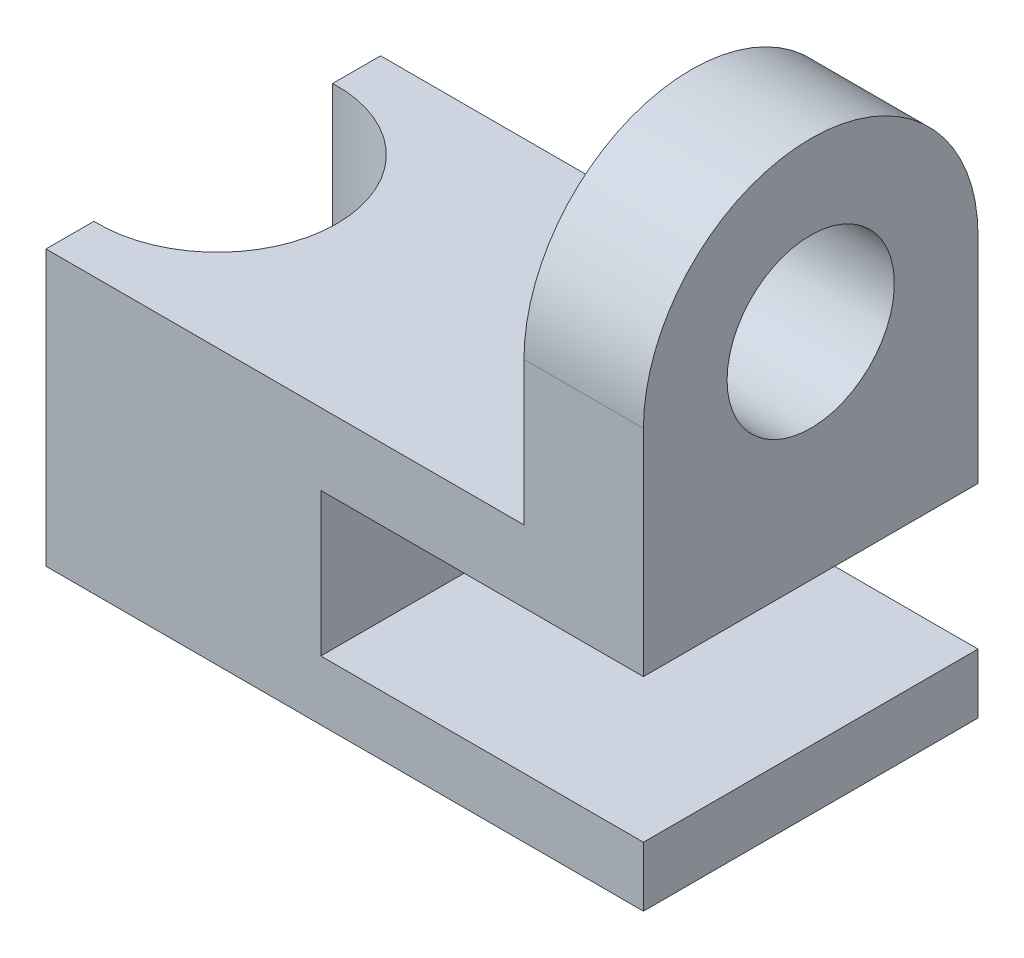
ISO-10303-21;
HEADER;
FILE_DESCRIPTION(('STEP AP214'),'2;1');
FILE_NAME('part.step','',(''),(''),'','','');
FILE_SCHEMA(('AUTOMOTIVE_DESIGN { 1 0 10303 214 1 1 1 1 }'));
ENDSEC;
DATA;
#1=APPLICATION_CONTEXT('core data for automotive mechanical design processes');
#2=APPLICATION_PROTOCOL_DEFINITION('international standard','automotive_design',2000,#1);
#3=PRODUCT_CONTEXT('',#1,'mechanical');
#4=PRODUCT('Part','Part','',(#3));
#5=PRODUCT_RELATED_PRODUCT_CATEGORY('part','',(#4));
#6=PRODUCT_DEFINITION_FORMATION('','',#4);
#7=PRODUCT_DEFINITION_CONTEXT('part definition',#1,'design');
#8=PRODUCT_DEFINITION('design','',#6,#7);
#9=PRODUCT_DEFINITION_SHAPE('','',#8);
#10=(LENGTH_UNIT() NAMED_UNIT(*) SI_UNIT(.MILLI.,.METRE.));
#11=(NAMED_UNIT(*) PLANE_ANGLE_UNIT() SI_UNIT($,.RADIAN.));
#12=(NAMED_UNIT(*) SI_UNIT($,.STERADIAN.) SOLID_ANGLE_UNIT());
#13=UNCERTAINTY_MEASURE_WITH_UNIT(LENGTH_MEASURE(1.E-05),#10,'distance_accuracy_value','');
#14=(GEOMETRIC_REPRESENTATION_CONTEXT(3) GLOBAL_UNCERTAINTY_ASSIGNED_CONTEXT((#13)) GLOBAL_UNIT_ASSIGNED_CONTEXT((#10,
#11,#12)) REPRESENTATION_CONTEXT('',''));
#15=CARTESIAN_POINT('',(0.,0.,0.));
#16=DIRECTION('',(0.,0.,1.));
#17=DIRECTION('',(1.,0.,0.));
#18=AXIS2_PLACEMENT_3D('',#15,#16,#17);
#19=CARTESIAN_POINT('',(-50000.,-5000.00000000001,28000.));
#20=DIRECTION('',(1.,0.,0.));
#21=DIRECTION('',(0.,0.,-1.));
#22=AXIS2_PLACEMENT_3D('',#19,#20,#21);
#23=PLANE('',#22);
#24=DIRECTION('',(0.,0.,-1.));
#25=VECTOR('',#24,1.);
#26=CARTESIAN_POINT('',(-50000.,-5000.00000000001,28000.));
#27=LINE('',#26,#25);
#28=CARTESIAN_POINT('',(-50000.,-5000.00000000001,4005.79463013171));
#29=VERTEX_POINT('',#28);
#30=CARTESIAN_POINT('',(-50000.,-5000.00000000001,0.));
#31=VERTEX_POINT('',#30);
#32=EDGE_CURVE('E142',#29,#31,#27,.T.);
#33=ORIENTED_EDGE('',*,*,#32,.F.);
#34=DIRECTION('',(0.,1.,0.));
#35=VECTOR('',#34,1.);
#36=CARTESIAN_POINT('',(-50000.,-5000.00000000001,4005.79463013171));
#37=LINE('',#36,#35);
#38=CARTESIAN_POINT('',(-50000.,18000.,4005.79463013171));
#39=VERTEX_POINT('',#38);
#40=EDGE_CURVE('E50',#29,#39,#37,.T.);
#41=ORIENTED_EDGE('',*,*,#40,.T.);
#42=DIRECTION('',(0.,0.,-1.));
#43=VECTOR('',#42,1.);
#44=CARTESIAN_POINT('',(-50000.,18000.,28000.));
#45=LINE('',#44,#43);
#46=CARTESIAN_POINT('',(-50000.,18000.,0.));
#47=VERTEX_POINT('',#46);
#48=EDGE_CURVE('E141',#39,#47,#45,.T.);
#49=ORIENTED_EDGE('',*,*,#48,.T.);
#50=DIRECTION('',(0.,-1.,0.));
#51=VECTOR('',#50,1.);
#52=CARTESIAN_POINT('',(-50000.,-5000.00000000001,0.));
#53=LINE('',#52,#51);
#54=EDGE_CURVE('E168',#47,#31,#53,.T.);
#55=ORIENTED_EDGE('',*,*,#54,.T.);
#56=EDGE_LOOP('',(#33,#41,#49,#55));
#57=FACE_BOUND('',#56,.T.);
#58=ADVANCED_FACE('F35',(#57),#23,.F.);
#59=CARTESIAN_POINT('',(-27000.,0.,28000.));
#60=DIRECTION('',(0.,-1.,0.));
#61=DIRECTION('',(0.,0.,-1.));
#62=AXIS2_PLACEMENT_3D('',#59,#60,#61);
#63=PLANE('',#62);
#64=DIRECTION('',(-1.,0.,0.));
#65=VECTOR('',#64,1.);
#66=CARTESIAN_POINT('',(-27000.,0.,0.));
#67=LINE('',#66,#65);
#68=CARTESIAN_POINT('',(0.,0.,0.));
#69=VERTEX_POINT('',#68);
#70=CARTESIAN_POINT('',(-27000.,0.,0.));
#71=VERTEX_POINT('',#70);
#72=EDGE_CURVE('E151',#69,#71,#67,.T.);
#73=ORIENTED_EDGE('',*,*,#72,.T.);
#74=DIRECTION('',(0.,0.,-1.));
#75=VECTOR('',#74,1.);
#76=CARTESIAN_POINT('',(-27000.,0.,28000.));
#77=LINE('',#76,#75);
#78=CARTESIAN_POINT('',(-27000.,0.,28000.));
#79=VERTEX_POINT('',#78);
#80=EDGE_CURVE('E11',#79,#71,#77,.T.);
#81=ORIENTED_EDGE('',*,*,#80,.F.);
#82=DIRECTION('',(-1.,0.,0.));
#83=VECTOR('',#82,1.);
#84=CARTESIAN_POINT('',(-27000.,0.,28000.));
#85=LINE('',#84,#83);
#86=CARTESIAN_POINT('',(0.,0.,28000.));
#87=VERTEX_POINT('',#86);
#88=EDGE_CURVE('E174',#87,#79,#85,.T.);
#89=ORIENTED_EDGE('',*,*,#88,.F.);
#90=DIRECTION('',(0.,0.,-1.));
#91=VECTOR('',#90,1.);
#92=CARTESIAN_POINT('',(0.,0.,28000.));
#93=LINE('',#92,#91);
#94=EDGE_CURVE('E147',#87,#69,#93,.T.);
#95=ORIENTED_EDGE('',*,*,#94,.T.);
#96=EDGE_LOOP('',(#73,#81,#89,#95));
#97=FACE_BOUND('',#96,.T.);
#98=ADVANCED_FACE('F37',(#97),#63,.F.);
#99=CARTESIAN_POINT('',(-27000.,12000.,28000.));
#100=DIRECTION('',(-1.,0.,0.));
#101=DIRECTION('',(0.,0.,1.));
#102=AXIS2_PLACEMENT_3D('',#99,#100,#101);
#103=PLANE('',#102);
#104=DIRECTION('',(0.,1.,0.));
#105=VECTOR('',#104,1.);
#106=CARTESIAN_POINT('',(-27000.,12000.,0.));
#107=LINE('',#106,#105);
#108=CARTESIAN_POINT('',(-27000.,12000.,0.));
#109=VERTEX_POINT('',#108);
#110=EDGE_CURVE('E154',#71,#109,#107,.T.);
#111=ORIENTED_EDGE('',*,*,#110,.T.);
#112=DIRECTION('',(0.,0.,-1.));
#113=VECTOR('',#112,1.);
#114=CARTESIAN_POINT('',(-27000.,12000.,28000.));
#115=LINE('',#114,#113);
#116=CARTESIAN_POINT('',(-27000.,12000.,28000.));
#117=VERTEX_POINT('',#116);
#118=EDGE_CURVE('E43',#117,#109,#115,.T.);
#119=ORIENTED_EDGE('',*,*,#118,.F.);
#120=DIRECTION('',(0.,1.,0.));
#121=VECTOR('',#120,1.);
#122=CARTESIAN_POINT('',(-27000.,12000.,28000.));
#123=LINE('',#122,#121);
#124=EDGE_CURVE('E103',#79,#117,#123,.T.);
#125=ORIENTED_EDGE('',*,*,#124,.F.);
#126=ORIENTED_EDGE('',*,*,#80,.T.);
#127=EDGE_LOOP('',(#111,#119,#125,#126));
#128=FACE_BOUND('',#127,.T.);
#129=ADVANCED_FACE('F253',(#128),#103,.F.);
#130=CARTESIAN_POINT('',(1.77635683940025E-12,12000.,28000.));
#131=DIRECTION('',(0.,1.,0.));
#132=DIRECTION('',(-1.,0.,0.));
#133=AXIS2_PLACEMENT_3D('',#130,#131,#132);
#134=PLANE('',#133);
#135=DIRECTION('',(1.,0.,0.));
#136=VECTOR('',#135,1.);
#137=CARTESIAN_POINT('',(1.77635683940025E-12,12000.,0.));
#138=LINE('',#137,#136);
#139=CARTESIAN_POINT('',(1.77635683940025E-12,12000.,0.));
#140=VERTEX_POINT('',#139);
#141=EDGE_CURVE('E156',#109,#140,#138,.T.);
#142=ORIENTED_EDGE('',*,*,#141,.T.);
#143=DIRECTION('',(0.,0.,-1.));
#144=VECTOR('',#143,1.);
#145=CARTESIAN_POINT('',(1.77635683940025E-12,12000.,28000.));
#146=LINE('',#145,#144);
#147=CARTESIAN_POINT('',(1.77635683940025E-12,12000.,28000.));
#148=VERTEX_POINT('',#147);
#149=EDGE_CURVE('E182',#148,#140,#146,.T.);
#150=ORIENTED_EDGE('',*,*,#149,.F.);
#151=DIRECTION('',(1.,0.,0.));
#152=VECTOR('',#151,1.);
#153=CARTESIAN_POINT('',(1.77635683940025E-12,12000.,28000.));
#154=LINE('',#153,#152);
#155=EDGE_CURVE('E190',#117,#148,#154,.T.);
#156=ORIENTED_EDGE('',*,*,#155,.F.);
#157=ORIENTED_EDGE('',*,*,#118,.T.);
#158=EDGE_LOOP('',(#142,#150,#156,#157));
#159=FACE_BOUND('',#158,.T.);
#160=ADVANCED_FACE('F188',(#159),#134,.F.);
#161=CARTESIAN_POINT('',(0.,30000.,28000.));
#162=DIRECTION('',(-1.,0.,0.));
#163=DIRECTION('',(0.,-1.,0.));
#164=AXIS2_PLACEMENT_3D('',#161,#162,#163);
#165=PLANE('',#164);
#166=CARTESIAN_POINT('',(1.77635683940025E-12,30000.,14000.));
#167=DIRECTION('',(-1.,0.,0.));
#168=DIRECTION('',(0.,0.,1.));
#169=AXIS2_PLACEMENT_3D('',#166,#167,#168);
#170=CIRCLE('',#169,7000.);
#171=CARTESIAN_POINT('',(1.77635683940025E-12,30000.,21000.));
#172=VERTEX_POINT('',#171);
#173=EDGE_CURVE('E236',#172,#172,#170,.T.);
#174=ORIENTED_EDGE('',*,*,#173,.T.);
#175=EDGE_LOOP('',(#174));
#176=FACE_BOUND('',#175,.T.);
#177=DIRECTION('',(0.,1.,0.));
#178=VECTOR('',#177,1.);
#179=CARTESIAN_POINT('',(0.,30000.,0.));
#180=LINE('',#179,#178);
#181=CARTESIAN_POINT('',(0.,30000.,0.));
#182=VERTEX_POINT('',#181);
#183=EDGE_CURVE('E158',#140,#182,#180,.T.);
#184=ORIENTED_EDGE('',*,*,#183,.T.);
#185=CARTESIAN_POINT('',(1.77635683940025E-12,30000.,14000.));
#186=DIRECTION('',(-1.,0.,0.));
#187=DIRECTION('',(0.,0.,1.));
#188=AXIS2_PLACEMENT_3D('',#185,#186,#187);
#189=CIRCLE('',#188,14000.);
#190=CARTESIAN_POINT('',(1.77635683940025E-12,30000.,28000.));
#191=VERTEX_POINT('',#190);
#192=EDGE_CURVE('E203',#191,#182,#189,.T.);
#193=ORIENTED_EDGE('',*,*,#192,.F.);
#194=DIRECTION('',(0.,1.,0.));
#195=VECTOR('',#194,1.);
#196=CARTESIAN_POINT('',(0.,30000.,28000.));
#197=LINE('',#196,#195);
#198=EDGE_CURVE('E205',#148,#191,#197,.T.);
#199=ORIENTED_EDGE('',*,*,#198,.F.);
#200=ORIENTED_EDGE('',*,*,#149,.T.);
#201=EDGE_LOOP('',(#184,#193,#199,#200));
#202=FACE_BOUND('',#201,.T.);
#203=ADVANCED_FACE('F200',(#176,#202),#165,.F.);
#204=CARTESIAN_POINT('',(-10000.,18000.,28000.));
#205=DIRECTION('',(1.,0.,0.));
#206=DIRECTION('',(0.,0.,-1.));
#207=AXIS2_PLACEMENT_3D('',#204,#205,#206);
#208=PLANE('',#207);
#209=CARTESIAN_POINT('',(-10000.,30000.,14000.));
#210=DIRECTION('',(-1.,0.,0.));
#211=DIRECTION('',(0.,0.,1.));
#212=AXIS2_PLACEMENT_3D('',#209,#210,#211);
#213=CIRCLE('',#212,14000.);
#214=CARTESIAN_POINT('',(-10000.,30000.,28000.));
#215=VERTEX_POINT('',#214);
#216=CARTESIAN_POINT('',(-10000.,30000.,0.));
#217=VERTEX_POINT('',#216);
#218=EDGE_CURVE('E235',#215,#217,#213,.T.);
#219=ORIENTED_EDGE('',*,*,#218,.T.);
#220=DIRECTION('',(0.,-1.,0.));
#221=VECTOR('',#220,1.);
#222=CARTESIAN_POINT('',(-10000.,18000.,0.));
#223=LINE('',#222,#221);
#224=CARTESIAN_POINT('',(-10000.,18000.,0.));
#225=VERTEX_POINT('',#224);
#226=EDGE_CURVE('E163',#217,#225,#223,.T.);
#227=ORIENTED_EDGE('',*,*,#226,.T.);
#228=DIRECTION('',(0.,0.,-1.));
#229=VECTOR('',#228,1.);
#230=CARTESIAN_POINT('',(-10000.,18000.,28000.));
#231=LINE('',#230,#229);
#232=CARTESIAN_POINT('',(-10000.,18000.,28000.));
#233=VERTEX_POINT('',#232);
#234=EDGE_CURVE('E179',#233,#225,#231,.T.);
#235=ORIENTED_EDGE('',*,*,#234,.F.);
#236=DIRECTION('',(0.,-1.,0.));
#237=VECTOR('',#236,1.);
#238=CARTESIAN_POINT('',(-10000.,18000.,28000.));
#239=LINE('',#238,#237);
#240=EDGE_CURVE('E209',#215,#233,#239,.T.);
#241=ORIENTED_EDGE('',*,*,#240,.F.);
#242=EDGE_LOOP('',(#219,#227,#235,#241));
#243=FACE_BOUND('',#242,.T.);
#244=CARTESIAN_POINT('',(-10000.,30000.,14000.));
#245=DIRECTION('',(-1.,0.,0.));
#246=DIRECTION('',(0.,0.,1.));
#247=AXIS2_PLACEMENT_3D('',#244,#245,#246);
#248=CIRCLE('',#247,7000.);
#249=CARTESIAN_POINT('',(-10000.,30000.,21000.));
#250=VERTEX_POINT('',#249);
#251=EDGE_CURVE('E237',#250,#250,#248,.T.);
#252=ORIENTED_EDGE('',*,*,#251,.F.);
#253=EDGE_LOOP('',(#252));
#254=FACE_BOUND('',#253,.T.);
#255=ADVANCED_FACE('F219',(#243,#254),#208,.F.);
#256=CARTESIAN_POINT('',(-50000.,18000.,28000.));
#257=DIRECTION('',(0.,-1.,0.));
#258=DIRECTION('',(0.,0.,-1.));
#259=AXIS2_PLACEMENT_3D('',#256,#257,#258);
#260=PLANE('',#259);
#261=ORIENTED_EDGE('',*,*,#48,.F.);
#262=CARTESIAN_POINT('',(-49659.6192941781,18000.,14000.));
#263=DIRECTION('',(0.,1.,0.));
#264=DIRECTION('',(0.,0.,1.));
#265=AXIS2_PLACEMENT_3D('',#262,#263,#264);
#266=CIRCLE('',#265,10000.);
#267=CARTESIAN_POINT('',(-50000.,18000.,23994.2053698683));
#268=VERTEX_POINT('',#267);
#269=EDGE_CURVE('E226',#268,#39,#266,.T.);
#270=ORIENTED_EDGE('',*,*,#269,.F.);
#271=CARTESIAN_POINT('',(-50000.,18000.,28000.));
#272=VERTEX_POINT('',#271);
#273=EDGE_CURVE('E177',#272,#268,#45,.T.);
#274=ORIENTED_EDGE('',*,*,#273,.F.);
#275=DIRECTION('',(-1.,0.,0.));
#276=VECTOR('',#275,1.);
#277=CARTESIAN_POINT('',(-50000.,18000.,28000.));
#278=LINE('',#277,#276);
#279=EDGE_CURVE('E129',#233,#272,#278,.T.);
#280=ORIENTED_EDGE('',*,*,#279,.F.);
#281=ORIENTED_EDGE('',*,*,#234,.T.);
#282=DIRECTION('',(-1.,0.,0.));
#283=VECTOR('',#282,1.);
#284=CARTESIAN_POINT('',(-50000.,18000.,0.));
#285=LINE('',#284,#283);
#286=EDGE_CURVE('E165',#225,#47,#285,.T.);
#287=ORIENTED_EDGE('',*,*,#286,.T.);
#288=EDGE_LOOP('',(#261,#270,#274,#280,#281,#287));
#289=FACE_BOUND('',#288,.T.);
#290=ADVANCED_FACE('F224',(#289),#260,.F.);
#291=ORIENTED_EDGE('',*,*,#273,.T.);
#292=DIRECTION('',(0.,1.,0.));
#293=VECTOR('',#292,1.);
#294=CARTESIAN_POINT('',(-50000.,-5000.00000000001,23994.2053698683));
#295=LINE('',#294,#293);
#296=CARTESIAN_POINT('',(-50000.,-5000.00000000001,23994.2053698683));
#297=VERTEX_POINT('',#296);
#298=EDGE_CURVE('E139',#297,#268,#295,.T.);
#299=ORIENTED_EDGE('',*,*,#298,.F.);
#300=CARTESIAN_POINT('',(-50000.,-5000.00000000001,28000.));
#301=VERTEX_POINT('',#300);
#302=EDGE_CURVE('E136',#301,#297,#27,.T.);
#303=ORIENTED_EDGE('',*,*,#302,.F.);
#304=DIRECTION('',(0.,-1.,0.));
#305=VECTOR('',#304,1.);
#306=CARTESIAN_POINT('',(-50000.,-5000.00000000001,28000.));
#307=LINE('',#306,#305);
#308=EDGE_CURVE('E122',#272,#301,#307,.T.);
#309=ORIENTED_EDGE('',*,*,#308,.F.);
#310=EDGE_LOOP('',(#291,#299,#303,#309));
#311=FACE_BOUND('',#310,.T.);
#312=ADVANCED_FACE('F137',(#311),#23,.F.);
#313=CARTESIAN_POINT('',(6.12323399573677E-13,-5000.,28000.));
#314=DIRECTION('',(0.,1.,0.));
#315=DIRECTION('',(-1.,0.,0.));
#316=AXIS2_PLACEMENT_3D('',#313,#314,#315);
#317=PLANE('',#316);
#318=ORIENTED_EDGE('',*,*,#302,.T.);
#319=CARTESIAN_POINT('',(-49659.6192941781,-5000.00000000001,14000.));
#320=DIRECTION('',(0.,1.,0.));
#321=DIRECTION('',(0.,0.,1.));
#322=AXIS2_PLACEMENT_3D('',#319,#320,#321);
#323=CIRCLE('',#322,10000.);
#324=EDGE_CURVE('E245',#297,#29,#323,.T.);
#325=ORIENTED_EDGE('',*,*,#324,.T.);
#326=ORIENTED_EDGE('',*,*,#32,.T.);
#327=DIRECTION('',(1.,0.,0.));
#328=VECTOR('',#327,1.);
#329=CARTESIAN_POINT('',(6.12323399573677E-13,-5000.,0.));
#330=LINE('',#329,#328);
#331=CARTESIAN_POINT('',(6.12323399573677E-13,-5000.,0.));
#332=VERTEX_POINT('',#331);
#333=EDGE_CURVE('E171',#31,#332,#330,.T.);
#334=ORIENTED_EDGE('',*,*,#333,.T.);
#335=DIRECTION('',(0.,0.,-1.));
#336=VECTOR('',#335,1.);
#337=CARTESIAN_POINT('',(6.12323399573677E-13,-5000.,28000.));
#338=LINE('',#337,#336);
#339=CARTESIAN_POINT('',(6.12323399573677E-13,-5000.,28000.));
#340=VERTEX_POINT('',#339);
#341=EDGE_CURVE('E145',#340,#332,#338,.T.);
#342=ORIENTED_EDGE('',*,*,#341,.F.);
#343=DIRECTION('',(1.,0.,0.));
#344=VECTOR('',#343,1.);
#345=CARTESIAN_POINT('',(6.12323399573677E-13,-5000.,28000.));
#346=LINE('',#345,#344);
#347=EDGE_CURVE('E126',#301,#340,#346,.T.);
#348=ORIENTED_EDGE('',*,*,#347,.F.);
#349=EDGE_LOOP('',(#318,#325,#326,#334,#342,#348));
#350=FACE_BOUND('',#349,.T.);
#351=ADVANCED_FACE('F144',(#350),#317,.F.);
#352=CARTESIAN_POINT('',(0.,0.,28000.));
#353=DIRECTION('',(-1.,0.,0.));
#354=DIRECTION('',(0.,-1.,0.));
#355=AXIS2_PLACEMENT_3D('',#352,#353,#354);
#356=PLANE('',#355);
#357=DIRECTION('',(0.,1.,0.));
#358=VECTOR('',#357,1.);
#359=CARTESIAN_POINT('',(0.,0.,0.));
#360=LINE('',#359,#358);
#361=EDGE_CURVE('E95',#332,#69,#360,.T.);
#362=ORIENTED_EDGE('',*,*,#361,.T.);
#363=ORIENTED_EDGE('',*,*,#94,.F.);
#364=DIRECTION('',(0.,1.,0.));
#365=VECTOR('',#364,1.);
#366=CARTESIAN_POINT('',(0.,0.,28000.));
#367=LINE('',#366,#365);
#368=EDGE_CURVE('E59',#340,#87,#367,.T.);
#369=ORIENTED_EDGE('',*,*,#368,.F.);
#370=ORIENTED_EDGE('',*,*,#341,.T.);
#371=EDGE_LOOP('',(#362,#363,#369,#370));
#372=FACE_BOUND('',#371,.T.);
#373=ADVANCED_FACE('F273',(#372),#356,.F.);
#374=CARTESIAN_POINT('',(0.,0.,28000.));
#375=DIRECTION('',(0.,0.,-1.));
#376=DIRECTION('',(-1.,0.,0.));
#377=AXIS2_PLACEMENT_3D('',#374,#375,#376);
#378=PLANE('',#377);
#379=ORIENTED_EDGE('',*,*,#88,.T.);
#380=ORIENTED_EDGE('',*,*,#124,.T.);
#381=ORIENTED_EDGE('',*,*,#155,.T.);
#382=ORIENTED_EDGE('',*,*,#198,.T.);
#383=DIRECTION('',(-1.,0.,0.));
#384=VECTOR('',#383,1.);
#385=CARTESIAN_POINT('',(-10000.,30000.,28000.));
#386=LINE('',#385,#384);
#387=EDGE_CURVE('E207',#191,#215,#386,.T.);
#388=ORIENTED_EDGE('',*,*,#387,.T.);
#389=ORIENTED_EDGE('',*,*,#240,.T.);
#390=ORIENTED_EDGE('',*,*,#279,.T.);
#391=ORIENTED_EDGE('',*,*,#308,.T.);
#392=ORIENTED_EDGE('',*,*,#347,.T.);
#393=ORIENTED_EDGE('',*,*,#368,.T.);
#394=EDGE_LOOP('',(#379,#380,#381,#382,#388,#389,#390,#391,#392,#393));
#395=FACE_BOUND('',#394,.T.);
#396=ADVANCED_FACE('F124',(#395),#378,.F.);
#397=CARTESIAN_POINT('',(0.,0.,0.));
#398=DIRECTION('',(0.,0.,-1.));
#399=DIRECTION('',(-1.,0.,0.));
#400=AXIS2_PLACEMENT_3D('',#397,#398,#399);
#401=PLANE('',#400);
#402=ORIENTED_EDGE('',*,*,#72,.F.);
#403=ORIENTED_EDGE('',*,*,#361,.F.);
#404=ORIENTED_EDGE('',*,*,#333,.F.);
#405=ORIENTED_EDGE('',*,*,#54,.F.);
#406=ORIENTED_EDGE('',*,*,#286,.F.);
#407=ORIENTED_EDGE('',*,*,#226,.F.);
#408=DIRECTION('',(-1.,0.,0.));
#409=VECTOR('',#408,1.);
#410=CARTESIAN_POINT('',(-10000.,30000.,0.));
#411=LINE('',#410,#409);
#412=EDGE_CURVE('E160',#182,#217,#411,.T.);
#413=ORIENTED_EDGE('',*,*,#412,.F.);
#414=ORIENTED_EDGE('',*,*,#183,.F.);
#415=ORIENTED_EDGE('',*,*,#141,.F.);
#416=ORIENTED_EDGE('',*,*,#110,.F.);
#417=EDGE_LOOP('',(#402,#403,#404,#405,#406,#407,#413,#414,#415,#416));
#418=FACE_BOUND('',#417,.T.);
#419=ADVANCED_FACE('F194',(#418),#401,.T.);
#420=CARTESIAN_POINT('',(-49659.6192941781,-5000.00000000001,14000.));
#421=DIRECTION('',(0.,1.,0.));
#422=DIRECTION('',(0.,0.,1.));
#423=AXIS2_PLACEMENT_3D('',#420,#421,#422);
#424=CYLINDRICAL_SURFACE('',#423,10000.);
#425=ORIENTED_EDGE('',*,*,#269,.T.);
#426=ORIENTED_EDGE('',*,*,#40,.F.);
#427=ORIENTED_EDGE('',*,*,#324,.F.);
#428=ORIENTED_EDGE('',*,*,#298,.T.);
#429=EDGE_LOOP('',(#425,#426,#427,#428));
#430=FACE_BOUND('',#429,.T.);
#431=ADVANCED_FACE('F287',(#430),#424,.F.);
#432=CARTESIAN_POINT('',(1.77635683940025E-12,30000.,14000.));
#433=DIRECTION('',(-1.,0.,0.));
#434=DIRECTION('',(0.,0.,1.));
#435=AXIS2_PLACEMENT_3D('',#432,#433,#434);
#436=CYLINDRICAL_SURFACE('',#435,7000.);
#437=ORIENTED_EDGE('',*,*,#251,.T.);
#438=EDGE_LOOP('',(#437));
#439=FACE_BOUND('',#438,.T.);
#440=ORIENTED_EDGE('',*,*,#173,.F.);
#441=EDGE_LOOP('',(#440));
#442=FACE_BOUND('',#441,.T.);
#443=ADVANCED_FACE('F285',(#439,#442),#436,.F.);
#444=CARTESIAN_POINT('',(1.77635683940025E-12,30000.,14000.));
#445=DIRECTION('',(-1.,0.,0.));
#446=DIRECTION('',(0.,0.,1.));
#447=AXIS2_PLACEMENT_3D('',#444,#445,#446);
#448=CYLINDRICAL_SURFACE('',#447,14000.);
#449=ORIENTED_EDGE('',*,*,#218,.F.);
#450=ORIENTED_EDGE('',*,*,#387,.F.);
#451=ORIENTED_EDGE('',*,*,#192,.T.);
#452=ORIENTED_EDGE('',*,*,#412,.T.);
#453=EDGE_LOOP('',(#449,#450,#451,#452));
#454=FACE_BOUND('',#453,.T.);
#455=ADVANCED_FACE('F234',(#454),#448,.T.);
#456=CLOSED_SHELL('',(#58,#98,#129,#160,#203,#255,#290,#312,#351,#373,#396,#419,#431,#443,#455));
#457=MANIFOLD_SOLID_BREP('B2',#456);
#458=ADVANCED_BREP_SHAPE_REPRESENTATION('',(#18,#457),#14);
#459=SHAPE_DEFINITION_REPRESENTATION(#9,#458);
ENDSEC;
END-ISO-10303-21;
